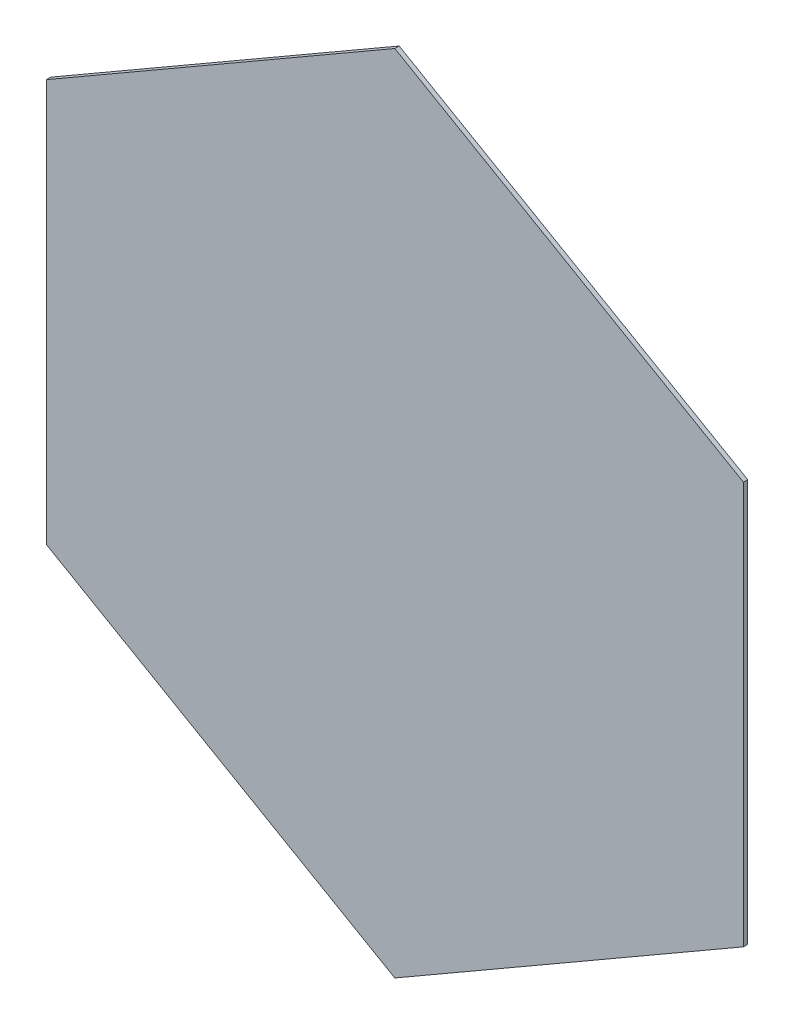
ISO-10303-21;
HEADER;
FILE_DESCRIPTION(('STEP AP214'),'2;1');
FILE_NAME('part.step','',(''),(''),'','','');
FILE_SCHEMA(('AUTOMOTIVE_DESIGN { 1 0 10303 214 1 1 1 1 }'));
ENDSEC;
DATA;
#1=APPLICATION_CONTEXT('core data for automotive mechanical design processes');
#2=APPLICATION_PROTOCOL_DEFINITION('international standard','automotive_design',2000,#1);
#3=PRODUCT_CONTEXT('',#1,'mechanical');
#4=PRODUCT('Part','Part','',(#3));
#5=PRODUCT_RELATED_PRODUCT_CATEGORY('part','',(#4));
#6=PRODUCT_DEFINITION_FORMATION('','',#4);
#7=PRODUCT_DEFINITION_CONTEXT('part definition',#1,'design');
#8=PRODUCT_DEFINITION('design','',#6,#7);
#9=PRODUCT_DEFINITION_SHAPE('','',#8);
#10=(LENGTH_UNIT() NAMED_UNIT(*) SI_UNIT(.MILLI.,.METRE.));
#11=(NAMED_UNIT(*) PLANE_ANGLE_UNIT() SI_UNIT($,.RADIAN.));
#12=(NAMED_UNIT(*) SI_UNIT($,.STERADIAN.) SOLID_ANGLE_UNIT());
#13=UNCERTAINTY_MEASURE_WITH_UNIT(LENGTH_MEASURE(1.E-05),#10,'distance_accuracy_value','');
#14=(GEOMETRIC_REPRESENTATION_CONTEXT(3) GLOBAL_UNCERTAINTY_ASSIGNED_CONTEXT((#13)) GLOBAL_UNIT_ASSIGNED_CONTEXT((#10,
#11,#12)) REPRESENTATION_CONTEXT('',''));
#15=CARTESIAN_POINT('',(0.,0.,0.));
#16=DIRECTION('',(0.,0.,1.));
#17=DIRECTION('',(1.,0.,0.));
#18=AXIS2_PLACEMENT_3D('',#15,#16,#17);
#19=CARTESIAN_POINT('',(0.,0.,1831.975));
#20=DIRECTION('',(0.,0.,-1.));
#21=DIRECTION('',(-1.,0.,0.));
#22=AXIS2_PLACEMENT_3D('',#19,#20,#21);
#23=PLANE('',#22);
#24=DIRECTION('',(0.,1.,0.));
#25=VECTOR('',#24,1.);
#26=CARTESIAN_POINT('',(-255.16572497106,-4.832051658839,1831.975));
#27=LINE('',#26,#25);
#28=CARTESIAN_POINT('',(-255.16572497106,147.32,1831.975));
#29=VERTEX_POINT('',#28);
#30=CARTESIAN_POINT('',(-255.16572497106,-147.319999999999,1831.975));
#31=VERTEX_POINT('',#30);
#32=EDGE_CURVE('E38',#29,#31,#27,.F.);
#33=ORIENTED_EDGE('',*,*,#32,.T.);
#34=DIRECTION('',(-0.866025403784429,0.500000000000017,0.));
#35=VECTOR('',#34,1.);
#36=CARTESIAN_POINT('',(-123.398182996562,-223.396025829432,1831.975));
#37=LINE('',#36,#35);
#38=CARTESIAN_POINT('',(-1.62270752390722E-12,-294.640000000004,1831.975));
#39=VERTEX_POINT('',#38);
#40=EDGE_CURVE('E119',#31,#39,#37,.F.);
#41=ORIENTED_EDGE('',*,*,#40,.T.);
#42=DIRECTION('',(-0.866025403784429,-0.500000000000017,0.));
#43=VECTOR('',#42,1.);
#44=CARTESIAN_POINT('',(131.767541974473,-218.563974170593,1831.975));
#45=LINE('',#44,#43);
#46=CARTESIAN_POINT('',(255.16572497106,-147.32,1831.975));
#47=VERTEX_POINT('',#46);
#48=EDGE_CURVE('E114',#39,#47,#45,.F.);
#49=ORIENTED_EDGE('',*,*,#48,.T.);
#50=DIRECTION('',(0.,1.,0.));
#51=VECTOR('',#50,1.);
#52=CARTESIAN_POINT('',(255.16572497106,4.83205165884408,1831.975));
#53=LINE('',#52,#51);
#54=CARTESIAN_POINT('',(255.165724971058,147.319999999997,1831.975));
#55=VERTEX_POINT('',#54);
#56=EDGE_CURVE('E110',#47,#55,#53,.T.);
#57=ORIENTED_EDGE('',*,*,#56,.T.);
#58=DIRECTION('',(0.866025403784429,-0.500000000000017,0.));
#59=VECTOR('',#58,1.);
#60=CARTESIAN_POINT('',(123.398182996587,223.396025829407,1831.975));
#61=LINE('',#60,#59);
#62=CARTESIAN_POINT('',(-8.88329144154173E-13,294.640000000002,1831.975));
#63=VERTEX_POINT('',#62);
#64=EDGE_CURVE('E86',#55,#63,#61,.F.);
#65=ORIENTED_EDGE('',*,*,#64,.T.);
#66=DIRECTION('',(0.866025403784429,0.500000000000017,0.));
#67=VECTOR('',#66,1.);
#68=CARTESIAN_POINT('',(-131.767541974473,218.563974170593,1831.975));
#69=LINE('',#68,#67);
#70=EDGE_CURVE('E88',#63,#29,#69,.F.);
#71=ORIENTED_EDGE('',*,*,#70,.T.);
#72=EDGE_LOOP('',(#33,#41,#49,#57,#65,#71));
#73=FACE_BOUND('',#72,.T.);
#74=ADVANCED_FACE('F35',(#73),#23,.F.);
#75=CARTESIAN_POINT('',(-255.16572497106,-4.832051658839,1831.975));
#76=DIRECTION('',(1.,0.,0.));
#77=DIRECTION('',(0.,0.,-1.));
#78=AXIS2_PLACEMENT_3D('',#75,#76,#77);
#79=PLANE('',#78);
#80=DIRECTION('',(0.,0.,1.));
#81=VECTOR('',#80,1.);
#82=CARTESIAN_POINT('',(-255.16572497106,147.32,1831.975));
#83=LINE('',#82,#81);
#84=CARTESIAN_POINT('',(-255.16572497106,147.32,1828.8));
#85=VERTEX_POINT('',#84);
#86=EDGE_CURVE('E94',#29,#85,#83,.F.);
#87=ORIENTED_EDGE('',*,*,#86,.T.);
#88=DIRECTION('',(0.,1.,0.));
#89=VECTOR('',#88,1.);
#90=CARTESIAN_POINT('',(-255.16572497106,0.,1828.8));
#91=LINE('',#90,#89);
#92=CARTESIAN_POINT('',(-255.16572497106,-147.319999999999,1828.8));
#93=VERTEX_POINT('',#92);
#94=EDGE_CURVE('E122',#93,#85,#91,.T.);
#95=ORIENTED_EDGE('',*,*,#94,.F.);
#96=DIRECTION('',(0.,0.,1.));
#97=VECTOR('',#96,1.);
#98=CARTESIAN_POINT('',(-255.165724971059,-147.319999999998,1831.975));
#99=LINE('',#98,#97);
#100=EDGE_CURVE('E100',#93,#31,#99,.T.);
#101=ORIENTED_EDGE('',*,*,#100,.T.);
#102=ORIENTED_EDGE('',*,*,#32,.F.);
#103=EDGE_LOOP('',(#87,#95,#101,#102));
#104=FACE_BOUND('',#103,.T.);
#105=ADVANCED_FACE('F97',(#104),#79,.F.);
#106=CARTESIAN_POINT('',(-131.767541974473,218.563974170593,1831.975));
#107=DIRECTION('',(0.500000000000017,-0.866025403784429,0.));
#108=DIRECTION('',(0.866025403784429,0.500000000000017,0.));
#109=AXIS2_PLACEMENT_3D('',#106,#107,#108);
#110=PLANE('',#109);
#111=ORIENTED_EDGE('',*,*,#86,.F.);
#112=ORIENTED_EDGE('',*,*,#70,.F.);
#113=DIRECTION('',(0.,0.,1.));
#114=VECTOR('',#113,1.);
#115=CARTESIAN_POINT('',(1.92901250528621E-12,294.639999999999,1831.975));
#116=LINE('',#115,#114);
#117=CARTESIAN_POINT('',(-6.11414120594483E-12,294.640000000004,1828.8));
#118=VERTEX_POINT('',#117);
#119=EDGE_CURVE('E106',#63,#118,#116,.F.);
#120=ORIENTED_EDGE('',*,*,#119,.T.);
#121=DIRECTION('',(0.866025403784445,0.499999999999989,0.));
#122=VECTOR('',#121,1.);
#123=CARTESIAN_POINT('',(-255.16572497106,147.32,1828.8));
#124=LINE('',#123,#122);
#125=EDGE_CURVE('E104',#85,#118,#124,.T.);
#126=ORIENTED_EDGE('',*,*,#125,.F.);
#127=EDGE_LOOP('',(#111,#112,#120,#126));
#128=FACE_BOUND('',#127,.T.);
#129=ADVANCED_FACE('F102',(#128),#110,.F.);
#130=CARTESIAN_POINT('',(123.398182996587,223.396025829407,1831.975));
#131=DIRECTION('',(-0.500000000000017,-0.866025403784429,0.));
#132=DIRECTION('',(0.866025403784429,-0.500000000000017,0.));
#133=AXIS2_PLACEMENT_3D('',#130,#131,#132);
#134=PLANE('',#133);
#135=ORIENTED_EDGE('',*,*,#119,.F.);
#136=ORIENTED_EDGE('',*,*,#64,.F.);
#137=DIRECTION('',(0.,0.,1.));
#138=VECTOR('',#137,1.);
#139=CARTESIAN_POINT('',(255.16572497106,147.32,1831.975));
#140=LINE('',#139,#138);
#141=CARTESIAN_POINT('',(255.165724971057,147.319999999995,1828.8));
#142=VERTEX_POINT('',#141);
#143=EDGE_CURVE('E112',#55,#142,#140,.F.);
#144=ORIENTED_EDGE('',*,*,#143,.T.);
#145=DIRECTION('',(0.866025403784455,-0.499999999999972,0.));
#146=VECTOR('',#145,1.);
#147=CARTESIAN_POINT('',(-5.76374439624482E-12,294.64,1828.8));
#148=LINE('',#147,#146);
#149=EDGE_CURVE('E125',#118,#142,#148,.T.);
#150=ORIENTED_EDGE('',*,*,#149,.F.);
#151=EDGE_LOOP('',(#135,#136,#144,#150));
#152=FACE_BOUND('',#151,.T.);
#153=ADVANCED_FACE('F142',(#152),#134,.F.);
#154=CARTESIAN_POINT('',(255.16572497106,4.83205165884408,1831.975));
#155=DIRECTION('',(-1.,0.,0.));
#156=DIRECTION('',(0.,0.,1.));
#157=AXIS2_PLACEMENT_3D('',#154,#155,#156);
#158=PLANE('',#157);
#159=ORIENTED_EDGE('',*,*,#143,.F.);
#160=ORIENTED_EDGE('',*,*,#56,.F.);
#161=DIRECTION('',(0.,0.,1.));
#162=VECTOR('',#161,1.);
#163=CARTESIAN_POINT('',(255.16572497106,-147.32,1831.975));
#164=LINE('',#163,#162);
#165=CARTESIAN_POINT('',(255.16572497106,-147.32,1828.8));
#166=VERTEX_POINT('',#165);
#167=EDGE_CURVE('E116',#47,#166,#164,.F.);
#168=ORIENTED_EDGE('',*,*,#167,.T.);
#169=DIRECTION('',(0.,1.,0.));
#170=VECTOR('',#169,1.);
#171=CARTESIAN_POINT('',(255.16572497106,0.,1828.8));
#172=LINE('',#171,#170);
#173=EDGE_CURVE('E128',#142,#166,#172,.F.);
#174=ORIENTED_EDGE('',*,*,#173,.F.);
#175=EDGE_LOOP('',(#159,#160,#168,#174));
#176=FACE_BOUND('',#175,.T.);
#177=ADVANCED_FACE('F140',(#176),#158,.F.);
#178=CARTESIAN_POINT('',(131.767541974473,-218.563974170593,1831.975));
#179=DIRECTION('',(-0.500000000000017,0.866025403784429,0.));
#180=DIRECTION('',(-0.866025403784429,-0.500000000000017,0.));
#181=AXIS2_PLACEMENT_3D('',#178,#179,#180);
#182=PLANE('',#181);
#183=ORIENTED_EDGE('',*,*,#167,.F.);
#184=ORIENTED_EDGE('',*,*,#48,.F.);
#185=DIRECTION('',(0.,0.,1.));
#186=VECTOR('',#185,1.);
#187=CARTESIAN_POINT('',(-7.72992780895265E-12,-294.640000000007,1831.975));
#188=LINE('',#187,#186);
#189=CARTESIAN_POINT('',(3.68037267328701E-12,-294.640000000006,1828.8));
#190=VERTEX_POINT('',#189);
#191=EDGE_CURVE('E53',#39,#190,#188,.F.);
#192=ORIENTED_EDGE('',*,*,#191,.T.);
#193=DIRECTION('',(-0.866025403784446,-0.499999999999987,0.));
#194=VECTOR('',#193,1.);
#195=CARTESIAN_POINT('',(255.16572497106,-147.32,1828.8));
#196=LINE('',#195,#194);
#197=EDGE_CURVE('E44',#166,#190,#196,.T.);
#198=ORIENTED_EDGE('',*,*,#197,.F.);
#199=EDGE_LOOP('',(#183,#184,#192,#198));
#200=FACE_BOUND('',#199,.T.);
#201=ADVANCED_FACE('F136',(#200),#182,.F.);
#202=CARTESIAN_POINT('',(-123.398182996562,-223.396025829432,1831.975));
#203=DIRECTION('',(0.500000000000017,0.866025403784429,0.));
#204=DIRECTION('',(-0.866025403784429,0.500000000000017,0.));
#205=AXIS2_PLACEMENT_3D('',#202,#203,#204);
#206=PLANE('',#205);
#207=ORIENTED_EDGE('',*,*,#191,.F.);
#208=ORIENTED_EDGE('',*,*,#40,.F.);
#209=ORIENTED_EDGE('',*,*,#100,.F.);
#210=DIRECTION('',(-0.866025403784453,0.499999999999975,0.));
#211=VECTOR('',#210,1.);
#212=CARTESIAN_POINT('',(4.19611012603068E-12,-294.64,1828.8));
#213=LINE('',#212,#211);
#214=EDGE_CURVE('E11',#190,#93,#213,.T.);
#215=ORIENTED_EDGE('',*,*,#214,.F.);
#216=EDGE_LOOP('',(#207,#208,#209,#215));
#217=FACE_BOUND('',#216,.T.);
#218=ADVANCED_FACE('F145',(#217),#206,.F.);
#219=CARTESIAN_POINT('',(0.,0.,1828.8));
#220=DIRECTION('',(0.,0.,-1.));
#221=DIRECTION('',(-1.,0.,0.));
#222=AXIS2_PLACEMENT_3D('',#219,#220,#221);
#223=PLANE('',#222);
#224=ORIENTED_EDGE('',*,*,#197,.T.);
#225=ORIENTED_EDGE('',*,*,#214,.T.);
#226=ORIENTED_EDGE('',*,*,#94,.T.);
#227=ORIENTED_EDGE('',*,*,#125,.T.);
#228=ORIENTED_EDGE('',*,*,#149,.T.);
#229=ORIENTED_EDGE('',*,*,#173,.T.);
#230=EDGE_LOOP('',(#224,#225,#226,#227,#228,#229));
#231=FACE_BOUND('',#230,.T.);
#232=ADVANCED_FACE('F133',(#231),#223,.T.);
#233=CLOSED_SHELL('',(#74,#105,#129,#153,#177,#201,#218,#232));
#234=MANIFOLD_SOLID_BREP('B2',#233);
#235=ADVANCED_BREP_SHAPE_REPRESENTATION('',(#18,#234),#14);
#236=SHAPE_DEFINITION_REPRESENTATION(#9,#235);
ENDSEC;
END-ISO-10303-21;
